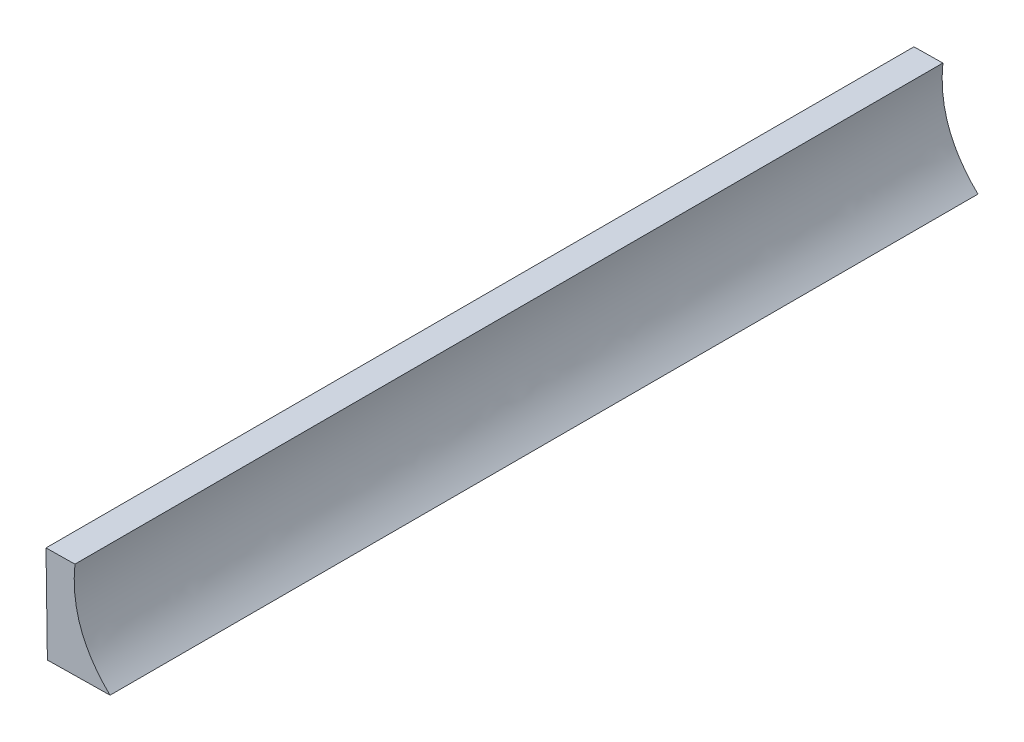
ISO-10303-21;
HEADER;
FILE_DESCRIPTION(('STEP AP214'),'2;1');
FILE_NAME('part.step','',(''),(''),'','','');
FILE_SCHEMA(('AUTOMOTIVE_DESIGN { 1 0 10303 214 1 1 1 1 }'));
ENDSEC;
DATA;
#1=APPLICATION_CONTEXT('core data for automotive mechanical design processes');
#2=APPLICATION_PROTOCOL_DEFINITION('international standard','automotive_design',2000,#1);
#3=PRODUCT_CONTEXT('',#1,'mechanical');
#4=PRODUCT('Part','Part','',(#3));
#5=PRODUCT_RELATED_PRODUCT_CATEGORY('part','',(#4));
#6=PRODUCT_DEFINITION_FORMATION('','',#4);
#7=PRODUCT_DEFINITION_CONTEXT('part definition',#1,'design');
#8=PRODUCT_DEFINITION('design','',#6,#7);
#9=PRODUCT_DEFINITION_SHAPE('','',#8);
#10=(LENGTH_UNIT() NAMED_UNIT(*) SI_UNIT(.MILLI.,.METRE.));
#11=(NAMED_UNIT(*) PLANE_ANGLE_UNIT() SI_UNIT($,.RADIAN.));
#12=(NAMED_UNIT(*) SI_UNIT($,.STERADIAN.) SOLID_ANGLE_UNIT());
#13=UNCERTAINTY_MEASURE_WITH_UNIT(LENGTH_MEASURE(1.E-05),#10,'distance_accuracy_value','');
#14=(GEOMETRIC_REPRESENTATION_CONTEXT(3) GLOBAL_UNCERTAINTY_ASSIGNED_CONTEXT((#13)) GLOBAL_UNIT_ASSIGNED_CONTEXT((#10,
#11,#12)) REPRESENTATION_CONTEXT('',''));
#15=CARTESIAN_POINT('',(0.,0.,0.));
#16=DIRECTION('',(0.,0.,1.));
#17=DIRECTION('',(1.,0.,0.));
#18=AXIS2_PLACEMENT_3D('',#15,#16,#17);
#19=CARTESIAN_POINT('',(-55.4984464447744,21.3681507600841,180.));
#20=DIRECTION('',(-0.0143293575664552,0.999897329485249,0.));
#21=DIRECTION('',(-0.999897329485249,-0.0143293575664552,0.));
#22=AXIS2_PLACEMENT_3D('',#19,#20,#21);
#23=PLANE('',#22);
#24=DIRECTION('',(0.999897329485249,0.0143293575664552,0.));
#25=VECTOR('',#24,1.);
#26=CARTESIAN_POINT('',(-55.4984464447744,21.3681507600841,0.));
#27=LINE('',#26,#25);
#28=CARTESIAN_POINT('',(-55.4984464447744,21.3681507600841,0.));
#29=VERTEX_POINT('',#28);
#30=CARTESIAN_POINT('',(-49.4984464447744,21.4541357336044,0.));
#31=VERTEX_POINT('',#30);
#32=EDGE_CURVE('E121',#29,#31,#27,.T.);
#33=ORIENTED_EDGE('',*,*,#32,.F.);
#34=DIRECTION('',(0.,0.,-1.));
#35=VECTOR('',#34,1.);
#36=CARTESIAN_POINT('',(-55.4984464447744,21.3681507600841,180.));
#37=LINE('',#36,#35);
#38=CARTESIAN_POINT('',(-55.4984464447744,21.3681507600841,180.));
#39=VERTEX_POINT('',#38);
#40=EDGE_CURVE('E11',#39,#29,#37,.T.);
#41=ORIENTED_EDGE('',*,*,#40,.F.);
#42=DIRECTION('',(0.999897329485249,0.0143293575664552,0.));
#43=VECTOR('',#42,1.);
#44=CARTESIAN_POINT('',(-55.4984464447744,21.3681507600841,180.));
#45=LINE('',#44,#43);
#46=CARTESIAN_POINT('',(-49.4984464447744,21.4541357336044,180.));
#47=VERTEX_POINT('',#46);
#48=EDGE_CURVE('E93',#39,#47,#45,.T.);
#49=ORIENTED_EDGE('',*,*,#48,.T.);
#50=DIRECTION('',(0.,0.,-1.));
#51=VECTOR('',#50,1.);
#52=CARTESIAN_POINT('',(-49.4984464447744,21.4541357336044,180.));
#53=LINE('',#52,#51);
#54=EDGE_CURVE('E36',#47,#31,#53,.T.);
#55=ORIENTED_EDGE('',*,*,#54,.T.);
#56=EDGE_LOOP('',(#33,#41,#49,#55));
#57=FACE_BOUND('',#56,.T.);
#58=ADVANCED_FACE('F33',(#57),#23,.T.);
#59=CARTESIAN_POINT('',(-55.4984464447744,21.3681507600841,180.));
#60=DIRECTION('',(0.999897329485249,0.014329357566455,0.));
#61=DIRECTION('',(-0.014329357566455,0.999897329485249,0.));
#62=AXIS2_PLACEMENT_3D('',#59,#60,#61);
#63=PLANE('',#62);
#64=DIRECTION('',(0.014329357566455,-0.999897329485249,0.));
#65=VECTOR('',#64,1.);
#66=CARTESIAN_POINT('',(-55.4984464447744,21.3681507600841,0.));
#67=LINE('',#66,#65);
#68=CARTESIAN_POINT('',(-55.2118592934453,1.37020417037915,0.));
#69=VERTEX_POINT('',#68);
#70=EDGE_CURVE('E66',#29,#69,#67,.T.);
#71=ORIENTED_EDGE('',*,*,#70,.T.);
#72=DIRECTION('',(0.,0.,-1.));
#73=VECTOR('',#72,1.);
#74=CARTESIAN_POINT('',(-55.2118592934453,1.37020417037915,180.));
#75=LINE('',#74,#73);
#76=CARTESIAN_POINT('',(-55.2118592934453,1.37020417037915,180.));
#77=VERTEX_POINT('',#76);
#78=EDGE_CURVE('E42',#77,#69,#75,.T.);
#79=ORIENTED_EDGE('',*,*,#78,.F.);
#80=DIRECTION('',(0.014329357566455,-0.999897329485249,0.));
#81=VECTOR('',#80,1.);
#82=CARTESIAN_POINT('',(-55.4984464447744,21.3681507600841,180.));
#83=LINE('',#82,#81);
#84=EDGE_CURVE('E83',#39,#77,#83,.T.);
#85=ORIENTED_EDGE('',*,*,#84,.F.);
#86=ORIENTED_EDGE('',*,*,#40,.T.);
#87=EDGE_LOOP('',(#71,#79,#85,#86));
#88=FACE_BOUND('',#87,.T.);
#89=ADVANCED_FACE('F107',(#88),#63,.F.);
#90=CARTESIAN_POINT('',(-55.2118592934453,1.37020417037915,180.));
#91=DIRECTION('',(-0.014329357566455,0.999897329485249,0.));
#92=DIRECTION('',(-0.999897329485249,-0.014329357566455,0.));
#93=AXIS2_PLACEMENT_3D('',#90,#91,#92);
#94=PLANE('',#93);
#95=DIRECTION('',(0.999897329485249,0.014329357566455,0.));
#96=VECTOR('',#95,1.);
#97=CARTESIAN_POINT('',(-55.2118592934453,1.37020417037915,0.));
#98=LINE('',#97,#96);
#99=CARTESIAN_POINT('',(-42.2118592934453,1.55650494633963,0.));
#100=VERTEX_POINT('',#99);
#101=EDGE_CURVE('E90',#69,#100,#98,.T.);
#102=ORIENTED_EDGE('',*,*,#101,.T.);
#103=DIRECTION('',(0.,0.,-1.));
#104=VECTOR('',#103,1.);
#105=CARTESIAN_POINT('',(-42.2118592934453,1.55650494633963,180.));
#106=LINE('',#105,#104);
#107=CARTESIAN_POINT('',(-42.2118592934453,1.55650494633963,180.));
#108=VERTEX_POINT('',#107);
#109=EDGE_CURVE('E87',#108,#100,#106,.T.);
#110=ORIENTED_EDGE('',*,*,#109,.F.);
#111=DIRECTION('',(0.999897329485249,0.014329357566455,0.));
#112=VECTOR('',#111,1.);
#113=CARTESIAN_POINT('',(-55.2118592934453,1.37020417037915,180.));
#114=LINE('',#113,#112);
#115=EDGE_CURVE('E78',#77,#108,#114,.T.);
#116=ORIENTED_EDGE('',*,*,#115,.F.);
#117=ORIENTED_EDGE('',*,*,#78,.T.);
#118=EDGE_LOOP('',(#102,#110,#116,#117));
#119=FACE_BOUND('',#118,.T.);
#120=ADVANCED_FACE('F88',(#119),#94,.F.);
#121=CARTESIAN_POINT('',(-49.4984464447744,21.4541357336044,180.));
#122=CARTESIAN_POINT('',(-50.7102929725788,9.6153314022183,180.));
#123=CARTESIAN_POINT('',(-42.2118592934453,1.55650494633963,180.));
#124=B_SPLINE_CURVE_WITH_KNOTS('',2,(#121,#122,#123),.UNSPECIFIED.,.F.,.F.,(3,3),(0.,1.),.UNSPECIFIED.);
#125=DIRECTION('',(0.,0.,-1.));
#126=VECTOR('',#125,1.);
#127=SURFACE_OF_LINEAR_EXTRUSION('',#124,#126);
#128=CARTESIAN_POINT('',(-49.4984464447744,21.4541357336044,0.));
#129=CARTESIAN_POINT('',(-50.7102929725788,9.6153314022183,0.));
#130=CARTESIAN_POINT('',(-42.2118592934453,1.55650494633963,0.));
#131=B_SPLINE_CURVE_WITH_KNOTS('',2,(#128,#129,#130),.UNSPECIFIED.,.F.,.F.,(3,3),(0.,1.),.UNSPECIFIED.);
#132=EDGE_CURVE('E122',#31,#100,#131,.T.);
#133=ORIENTED_EDGE('',*,*,#132,.F.);
#134=ORIENTED_EDGE('',*,*,#54,.F.);
#135=EDGE_CURVE('E82',#47,#108,#124,.T.);
#136=ORIENTED_EDGE('',*,*,#135,.T.);
#137=ORIENTED_EDGE('',*,*,#109,.T.);
#138=EDGE_LOOP('',(#133,#134,#136,#137));
#139=FACE_BOUND('',#138,.T.);
#140=ADVANCED_FACE('F92',(#139),#127,.T.);
#141=CARTESIAN_POINT('',(-48.2827229208443,10.5603258710952,180.));
#142=DIRECTION('',(0.,0.,-1.));
#143=DIRECTION('',(-1.,0.,0.));
#144=AXIS2_PLACEMENT_3D('',#141,#142,#143);
#145=PLANE('',#144);
#146=ORIENTED_EDGE('',*,*,#48,.F.);
#147=ORIENTED_EDGE('',*,*,#84,.T.);
#148=ORIENTED_EDGE('',*,*,#115,.T.);
#149=ORIENTED_EDGE('',*,*,#135,.F.);
#150=EDGE_LOOP('',(#146,#147,#148,#149));
#151=FACE_BOUND('',#150,.T.);
#152=ADVANCED_FACE('F81',(#151),#145,.F.);
#153=CARTESIAN_POINT('',(-48.2827229208443,10.5603258710952,0.));
#154=DIRECTION('',(0.,0.,-1.));
#155=DIRECTION('',(-1.,0.,0.));
#156=AXIS2_PLACEMENT_3D('',#153,#154,#155);
#157=PLANE('',#156);
#158=ORIENTED_EDGE('',*,*,#32,.T.);
#159=ORIENTED_EDGE('',*,*,#132,.T.);
#160=ORIENTED_EDGE('',*,*,#101,.F.);
#161=ORIENTED_EDGE('',*,*,#70,.F.);
#162=EDGE_LOOP('',(#158,#159,#160,#161));
#163=FACE_BOUND('',#162,.T.);
#164=ADVANCED_FACE('F110',(#163),#157,.T.);
#165=CLOSED_SHELL('',(#58,#89,#120,#140,#152,#164));
#166=MANIFOLD_SOLID_BREP('B2',#165);
#167=ADVANCED_BREP_SHAPE_REPRESENTATION('',(#18,#166),#14);
#168=SHAPE_DEFINITION_REPRESENTATION(#9,#167);
ENDSEC;
END-ISO-10303-21;
